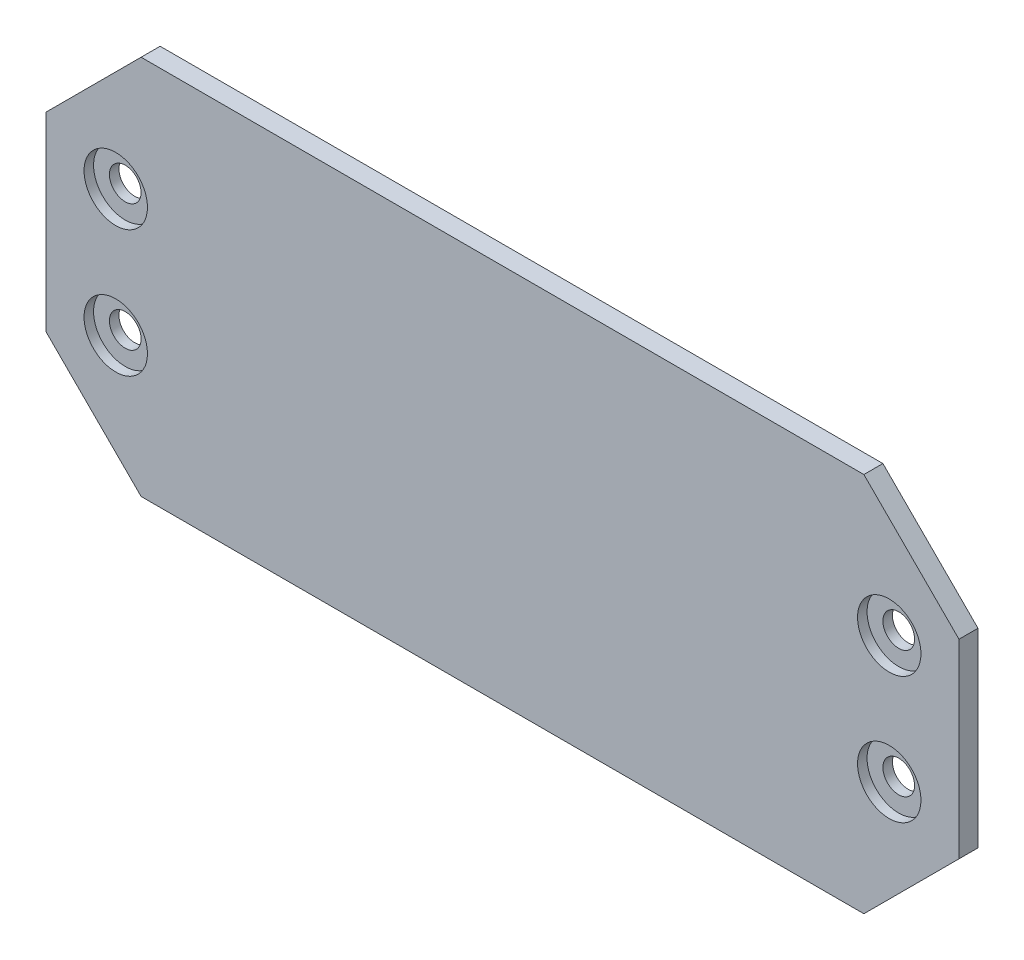
ISO-10303-21;
HEADER;
FILE_DESCRIPTION(('STEP AP214'),'2;1');
FILE_NAME('part.step','',(''),(''),'','','');
FILE_SCHEMA(('AUTOMOTIVE_DESIGN { 1 0 10303 214 1 1 1 1 }'));
ENDSEC;
DATA;
#1=APPLICATION_CONTEXT('core data for automotive mechanical design processes');
#2=APPLICATION_PROTOCOL_DEFINITION('international standard','automotive_design',2000,#1);
#3=PRODUCT_CONTEXT('',#1,'mechanical');
#4=PRODUCT('Part','Part','',(#3));
#5=PRODUCT_RELATED_PRODUCT_CATEGORY('part','',(#4));
#6=PRODUCT_DEFINITION_FORMATION('','',#4);
#7=PRODUCT_DEFINITION_CONTEXT('part definition',#1,'design');
#8=PRODUCT_DEFINITION('design','',#6,#7);
#9=PRODUCT_DEFINITION_SHAPE('','',#8);
#10=(LENGTH_UNIT() NAMED_UNIT(*) SI_UNIT(.MILLI.,.METRE.));
#11=(NAMED_UNIT(*) PLANE_ANGLE_UNIT() SI_UNIT($,.RADIAN.));
#12=(NAMED_UNIT(*) SI_UNIT($,.STERADIAN.) SOLID_ANGLE_UNIT());
#13=UNCERTAINTY_MEASURE_WITH_UNIT(LENGTH_MEASURE(1.E-05),#10,'distance_accuracy_value','');
#14=(GEOMETRIC_REPRESENTATION_CONTEXT(3) GLOBAL_UNCERTAINTY_ASSIGNED_CONTEXT((#13)) GLOBAL_UNIT_ASSIGNED_CONTEXT((#10,
#11,#12)) REPRESENTATION_CONTEXT('',''));
#15=CARTESIAN_POINT('',(0.,0.,0.));
#16=DIRECTION('',(0.,0.,1.));
#17=DIRECTION('',(1.,0.,0.));
#18=AXIS2_PLACEMENT_3D('',#15,#16,#17);
#19=CARTESIAN_POINT('',(-61.,10.,3.));
#20=DIRECTION('',(0.,0.,-1.));
#21=DIRECTION('',(-1.,0.,0.));
#22=AXIS2_PLACEMENT_3D('',#19,#20,#21);
#23=CYLINDRICAL_SURFACE('',#22,2.5);
#24=CARTESIAN_POINT('',(-61.,10.,0.));
#25=DIRECTION('',(0.,0.,1.));
#26=DIRECTION('',(1.,0.,0.));
#27=AXIS2_PLACEMENT_3D('',#24,#25,#26);
#28=CIRCLE('',#27,2.5);
#29=CARTESIAN_POINT('',(-58.5,10.,0.));
#30=VERTEX_POINT('',#29);
#31=EDGE_CURVE('E156',#30,#30,#28,.T.);
#32=ORIENTED_EDGE('',*,*,#31,.F.);
#33=EDGE_LOOP('',(#32));
#34=FACE_BOUND('',#33,.T.);
#35=CARTESIAN_POINT('',(-61.,10.,1.5));
#36=DIRECTION('',(0.,0.,1.));
#37=DIRECTION('',(1.,0.,0.));
#38=AXIS2_PLACEMENT_3D('',#35,#36,#37);
#39=CIRCLE('',#38,2.5);
#40=CARTESIAN_POINT('',(-58.5,10.,1.5));
#41=VERTEX_POINT('',#40);
#42=EDGE_CURVE('E42',#41,#41,#39,.T.);
#43=ORIENTED_EDGE('',*,*,#42,.T.);
#44=EDGE_LOOP('',(#43));
#45=FACE_BOUND('',#44,.T.);
#46=ADVANCED_FACE('F38',(#34,#45),#23,.F.);
#47=CARTESIAN_POINT('',(61.,10.,3.));
#48=DIRECTION('',(0.,0.,-1.));
#49=DIRECTION('',(-1.,0.,0.));
#50=AXIS2_PLACEMENT_3D('',#47,#48,#49);
#51=CYLINDRICAL_SURFACE('',#50,2.5);
#52=CARTESIAN_POINT('',(61.,10.,0.));
#53=DIRECTION('',(0.,0.,1.));
#54=DIRECTION('',(-1.,0.,0.));
#55=AXIS2_PLACEMENT_3D('',#52,#53,#54);
#56=CIRCLE('',#55,2.5);
#57=CARTESIAN_POINT('',(58.5,10.,0.));
#58=VERTEX_POINT('',#57);
#59=EDGE_CURVE('E218',#58,#58,#56,.T.);
#60=ORIENTED_EDGE('',*,*,#59,.F.);
#61=EDGE_LOOP('',(#60));
#62=FACE_BOUND('',#61,.T.);
#63=CARTESIAN_POINT('',(61.,10.,1.5));
#64=DIRECTION('',(0.,0.,1.));
#65=DIRECTION('',(1.,0.,0.));
#66=AXIS2_PLACEMENT_3D('',#63,#64,#65);
#67=CIRCLE('',#66,2.5);
#68=CARTESIAN_POINT('',(63.5,10.,1.5));
#69=VERTEX_POINT('',#68);
#70=EDGE_CURVE('E190',#69,#69,#67,.T.);
#71=ORIENTED_EDGE('',*,*,#70,.T.);
#72=EDGE_LOOP('',(#71));
#73=FACE_BOUND('',#72,.T.);
#74=ADVANCED_FACE('F262',(#62,#73),#51,.F.);
#75=CARTESIAN_POINT('',(61.,-10.,3.));
#76=DIRECTION('',(0.,0.,-1.));
#77=DIRECTION('',(-1.,0.,0.));
#78=AXIS2_PLACEMENT_3D('',#75,#76,#77);
#79=CYLINDRICAL_SURFACE('',#78,2.5);
#80=CARTESIAN_POINT('',(61.,-10.,0.));
#81=DIRECTION('',(0.,0.,1.));
#82=DIRECTION('',(1.,0.,0.));
#83=AXIS2_PLACEMENT_3D('',#80,#81,#82);
#84=CIRCLE('',#83,2.5);
#85=CARTESIAN_POINT('',(63.5,-10.,0.));
#86=VERTEX_POINT('',#85);
#87=EDGE_CURVE('E215',#86,#86,#84,.T.);
#88=ORIENTED_EDGE('',*,*,#87,.F.);
#89=EDGE_LOOP('',(#88));
#90=FACE_BOUND('',#89,.T.);
#91=CARTESIAN_POINT('',(61.,-10.,1.5));
#92=DIRECTION('',(0.,0.,1.));
#93=DIRECTION('',(1.,0.,0.));
#94=AXIS2_PLACEMENT_3D('',#91,#92,#93);
#95=CIRCLE('',#94,2.5);
#96=CARTESIAN_POINT('',(63.5,-10.,1.5));
#97=VERTEX_POINT('',#96);
#98=EDGE_CURVE('E188',#97,#97,#95,.T.);
#99=ORIENTED_EDGE('',*,*,#98,.T.);
#100=EDGE_LOOP('',(#99));
#101=FACE_BOUND('',#100,.T.);
#102=ADVANCED_FACE('F268',(#90,#101),#79,.F.);
#103=CARTESIAN_POINT('',(-61.,-10.,3.));
#104=DIRECTION('',(0.,0.,-1.));
#105=DIRECTION('',(-1.,0.,0.));
#106=AXIS2_PLACEMENT_3D('',#103,#104,#105);
#107=CYLINDRICAL_SURFACE('',#106,2.5);
#108=CARTESIAN_POINT('',(-61.,-10.,0.));
#109=DIRECTION('',(0.,0.,1.));
#110=DIRECTION('',(-1.,0.,0.));
#111=AXIS2_PLACEMENT_3D('',#108,#109,#110);
#112=CIRCLE('',#111,2.5);
#113=CARTESIAN_POINT('',(-63.5,-10.,0.));
#114=VERTEX_POINT('',#113);
#115=EDGE_CURVE('E186',#114,#114,#112,.T.);
#116=ORIENTED_EDGE('',*,*,#115,.F.);
#117=EDGE_LOOP('',(#116));
#118=FACE_BOUND('',#117,.T.);
#119=CARTESIAN_POINT('',(-61.,-10.,1.5));
#120=DIRECTION('',(0.,0.,1.));
#121=DIRECTION('',(1.,0.,0.));
#122=AXIS2_PLACEMENT_3D('',#119,#120,#121);
#123=CIRCLE('',#122,2.5);
#124=CARTESIAN_POINT('',(-58.5,-10.,1.5));
#125=VERTEX_POINT('',#124);
#126=EDGE_CURVE('E183',#125,#125,#123,.T.);
#127=ORIENTED_EDGE('',*,*,#126,.T.);
#128=EDGE_LOOP('',(#127));
#129=FACE_BOUND('',#128,.T.);
#130=ADVANCED_FACE('F275',(#118,#129),#107,.F.);
#131=CARTESIAN_POINT('',(0.,0.,3.));
#132=DIRECTION('',(0.,0.,-1.));
#133=DIRECTION('',(-1.,0.,0.));
#134=AXIS2_PLACEMENT_3D('',#131,#132,#133);
#135=PLANE('',#134);
#136=CARTESIAN_POINT('',(-61.,10.,3.));
#137=DIRECTION('',(0.,0.,1.));
#138=DIRECTION('',(1.,0.,0.));
#139=AXIS2_PLACEMENT_3D('',#136,#137,#138);
#140=CIRCLE('',#139,5.);
#141=CARTESIAN_POINT('',(-56.,10.,3.));
#142=VERTEX_POINT('',#141);
#143=EDGE_CURVE('E312',#142,#142,#140,.T.);
#144=ORIENTED_EDGE('',*,*,#143,.F.);
#145=EDGE_LOOP('',(#144));
#146=FACE_BOUND('',#145,.T.);
#147=CARTESIAN_POINT('',(61.,10.,3.));
#148=DIRECTION('',(0.,0.,1.));
#149=DIRECTION('',(1.,0.,0.));
#150=AXIS2_PLACEMENT_3D('',#147,#148,#149);
#151=CIRCLE('',#150,5.);
#152=CARTESIAN_POINT('',(66.,10.,3.));
#153=VERTEX_POINT('',#152);
#154=EDGE_CURVE('E301',#153,#153,#151,.T.);
#155=ORIENTED_EDGE('',*,*,#154,.F.);
#156=EDGE_LOOP('',(#155));
#157=FACE_BOUND('',#156,.T.);
#158=CARTESIAN_POINT('',(61.,-10.,3.));
#159=DIRECTION('',(0.,0.,1.));
#160=DIRECTION('',(1.,0.,0.));
#161=AXIS2_PLACEMENT_3D('',#158,#159,#160);
#162=CIRCLE('',#161,5.);
#163=CARTESIAN_POINT('',(66.,-10.,3.));
#164=VERTEX_POINT('',#163);
#165=EDGE_CURVE('E302',#164,#164,#162,.T.);
#166=ORIENTED_EDGE('',*,*,#165,.F.);
#167=EDGE_LOOP('',(#166));
#168=FACE_BOUND('',#167,.T.);
#169=CARTESIAN_POINT('',(-61.,-10.,3.));
#170=DIRECTION('',(0.,0.,1.));
#171=DIRECTION('',(1.,0.,0.));
#172=AXIS2_PLACEMENT_3D('',#169,#170,#171);
#173=CIRCLE('',#172,5.);
#174=CARTESIAN_POINT('',(-56.,-10.,3.));
#175=VERTEX_POINT('',#174);
#176=EDGE_CURVE('E200',#175,#175,#173,.T.);
#177=ORIENTED_EDGE('',*,*,#176,.F.);
#178=EDGE_LOOP('',(#177));
#179=FACE_BOUND('',#178,.T.);
#180=DIRECTION('',(-0.707106781186541,-0.707106781186554,0.));
#181=VECTOR('',#180,1.);
#182=CARTESIAN_POINT('',(-57.0000000000003,30.,3.));
#183=LINE('',#182,#181);
#184=CARTESIAN_POINT('',(-57.0000000000003,30.,3.));
#185=VERTEX_POINT('',#184);
#186=CARTESIAN_POINT('',(-72.,15.,3.));
#187=VERTEX_POINT('',#186);
#188=EDGE_CURVE('E170',#185,#187,#183,.T.);
#189=ORIENTED_EDGE('',*,*,#188,.T.);
#190=DIRECTION('',(0.,-1.,0.));
#191=VECTOR('',#190,1.);
#192=CARTESIAN_POINT('',(-72.,15.,3.));
#193=LINE('',#192,#191);
#194=CARTESIAN_POINT('',(-72.,-15.,3.));
#195=VERTEX_POINT('',#194);
#196=EDGE_CURVE('E107',#187,#195,#193,.T.);
#197=ORIENTED_EDGE('',*,*,#196,.T.);
#198=DIRECTION('',(0.707106781186541,-0.707106781186554,0.));
#199=VECTOR('',#198,1.);
#200=CARTESIAN_POINT('',(-57.0000000000003,-30.,3.));
#201=LINE('',#200,#199);
#202=CARTESIAN_POINT('',(-57.0000000000003,-30.,3.));
#203=VERTEX_POINT('',#202);
#204=EDGE_CURVE('E227',#195,#203,#201,.T.);
#205=ORIENTED_EDGE('',*,*,#204,.T.);
#206=DIRECTION('',(1.,0.,0.));
#207=VECTOR('',#206,1.);
#208=CARTESIAN_POINT('',(-57.0000000000003,-30.,3.));
#209=LINE('',#208,#207);
#210=CARTESIAN_POINT('',(57.0000000000003,-30.,3.));
#211=VERTEX_POINT('',#210);
#212=EDGE_CURVE('E229',#203,#211,#209,.T.);
#213=ORIENTED_EDGE('',*,*,#212,.T.);
#214=DIRECTION('',(0.707106781186541,0.707106781186554,0.));
#215=VECTOR('',#214,1.);
#216=CARTESIAN_POINT('',(57.0000000000003,-30.,3.));
#217=LINE('',#216,#215);
#218=CARTESIAN_POINT('',(72.,-15.,3.));
#219=VERTEX_POINT('',#218);
#220=EDGE_CURVE('E127',#211,#219,#217,.T.);
#221=ORIENTED_EDGE('',*,*,#220,.T.);
#222=DIRECTION('',(0.,1.,0.));
#223=VECTOR('',#222,1.);
#224=CARTESIAN_POINT('',(72.,15.,3.));
#225=LINE('',#224,#223);
#226=CARTESIAN_POINT('',(72.,15.,3.));
#227=VERTEX_POINT('',#226);
#228=EDGE_CURVE('E121',#219,#227,#225,.T.);
#229=ORIENTED_EDGE('',*,*,#228,.T.);
#230=DIRECTION('',(-0.707106781186541,0.707106781186554,0.));
#231=VECTOR('',#230,1.);
#232=CARTESIAN_POINT('',(57.0000000000003,30.,3.));
#233=LINE('',#232,#231);
#234=CARTESIAN_POINT('',(57.0000000000003,30.,3.));
#235=VERTEX_POINT('',#234);
#236=EDGE_CURVE('E125',#227,#235,#233,.T.);
#237=ORIENTED_EDGE('',*,*,#236,.T.);
#238=DIRECTION('',(-1.,0.,0.));
#239=VECTOR('',#238,1.);
#240=CARTESIAN_POINT('',(-57.0000000000003,30.,3.));
#241=LINE('',#240,#239);
#242=EDGE_CURVE('E61',#235,#185,#241,.T.);
#243=ORIENTED_EDGE('',*,*,#242,.T.);
#244=EDGE_LOOP('',(#189,#197,#205,#213,#221,#229,#237,#243));
#245=FACE_BOUND('',#244,.T.);
#246=ADVANCED_FACE('F123',(#146,#157,#168,#179,#245),#135,.F.);
#247=CARTESIAN_POINT('',(0.,0.,0.));
#248=DIRECTION('',(0.,0.,-1.));
#249=DIRECTION('',(-1.,0.,0.));
#250=AXIS2_PLACEMENT_3D('',#247,#248,#249);
#251=PLANE('',#250);
#252=ORIENTED_EDGE('',*,*,#87,.T.);
#253=EDGE_LOOP('',(#252));
#254=FACE_BOUND('',#253,.T.);
#255=ORIENTED_EDGE('',*,*,#31,.T.);
#256=EDGE_LOOP('',(#255));
#257=FACE_BOUND('',#256,.T.);
#258=DIRECTION('',(-0.707106781186541,-0.707106781186554,0.));
#259=VECTOR('',#258,1.);
#260=CARTESIAN_POINT('',(-57.0000000000003,30.,0.));
#261=LINE('',#260,#259);
#262=CARTESIAN_POINT('',(-57.0000000000003,30.,0.));
#263=VERTEX_POINT('',#262);
#264=CARTESIAN_POINT('',(-72.,15.,0.));
#265=VERTEX_POINT('',#264);
#266=EDGE_CURVE('E151',#263,#265,#261,.T.);
#267=ORIENTED_EDGE('',*,*,#266,.F.);
#268=DIRECTION('',(-1.,0.,0.));
#269=VECTOR('',#268,1.);
#270=CARTESIAN_POINT('',(-57.0000000000003,30.,0.));
#271=LINE('',#270,#269);
#272=CARTESIAN_POINT('',(57.0000000000003,30.,0.));
#273=VERTEX_POINT('',#272);
#274=EDGE_CURVE('E99',#273,#263,#271,.T.);
#275=ORIENTED_EDGE('',*,*,#274,.F.);
#276=DIRECTION('',(-0.707106781186541,0.707106781186554,0.));
#277=VECTOR('',#276,1.);
#278=CARTESIAN_POINT('',(57.0000000000003,30.,0.));
#279=LINE('',#278,#277);
#280=CARTESIAN_POINT('',(72.,15.,0.));
#281=VERTEX_POINT('',#280);
#282=EDGE_CURVE('E93',#281,#273,#279,.T.);
#283=ORIENTED_EDGE('',*,*,#282,.F.);
#284=DIRECTION('',(0.,1.,0.));
#285=VECTOR('',#284,1.);
#286=CARTESIAN_POINT('',(72.,15.,0.));
#287=LINE('',#286,#285);
#288=CARTESIAN_POINT('',(72.,-15.,0.));
#289=VERTEX_POINT('',#288);
#290=EDGE_CURVE('E136',#289,#281,#287,.T.);
#291=ORIENTED_EDGE('',*,*,#290,.F.);
#292=DIRECTION('',(0.707106781186541,0.707106781186554,0.));
#293=VECTOR('',#292,1.);
#294=CARTESIAN_POINT('',(57.0000000000003,-30.,0.));
#295=LINE('',#294,#293);
#296=CARTESIAN_POINT('',(57.0000000000003,-30.,0.));
#297=VERTEX_POINT('',#296);
#298=EDGE_CURVE('E162',#297,#289,#295,.T.);
#299=ORIENTED_EDGE('',*,*,#298,.F.);
#300=DIRECTION('',(1.,0.,0.));
#301=VECTOR('',#300,1.);
#302=CARTESIAN_POINT('',(-57.0000000000003,-30.,0.));
#303=LINE('',#302,#301);
#304=CARTESIAN_POINT('',(-57.0000000000003,-30.,0.));
#305=VERTEX_POINT('',#304);
#306=EDGE_CURVE('E160',#305,#297,#303,.T.);
#307=ORIENTED_EDGE('',*,*,#306,.F.);
#308=DIRECTION('',(0.707106781186541,-0.707106781186554,0.));
#309=VECTOR('',#308,1.);
#310=CARTESIAN_POINT('',(-57.0000000000003,-30.,0.));
#311=LINE('',#310,#309);
#312=CARTESIAN_POINT('',(-72.,-15.,0.));
#313=VERTEX_POINT('',#312);
#314=EDGE_CURVE('E158',#313,#305,#311,.T.);
#315=ORIENTED_EDGE('',*,*,#314,.F.);
#316=DIRECTION('',(0.,-1.,0.));
#317=VECTOR('',#316,1.);
#318=CARTESIAN_POINT('',(-72.,15.,0.));
#319=LINE('',#318,#317);
#320=EDGE_CURVE('E155',#265,#313,#319,.T.);
#321=ORIENTED_EDGE('',*,*,#320,.F.);
#322=EDGE_LOOP('',(#267,#275,#283,#291,#299,#307,#315,#321));
#323=FACE_BOUND('',#322,.T.);
#324=ORIENTED_EDGE('',*,*,#59,.T.);
#325=EDGE_LOOP('',(#324));
#326=FACE_BOUND('',#325,.T.);
#327=ORIENTED_EDGE('',*,*,#115,.T.);
#328=EDGE_LOOP('',(#327));
#329=FACE_BOUND('',#328,.T.);
#330=ADVANCED_FACE('F242',(#254,#257,#323,#326,#329),#251,.T.);
#331=CARTESIAN_POINT('',(-57.0000000000003,30.,3.));
#332=DIRECTION('',(0.707106781186554,-0.707106781186541,0.));
#333=DIRECTION('',(0.707106781186541,0.707106781186554,0.));
#334=AXIS2_PLACEMENT_3D('',#331,#332,#333);
#335=PLANE('',#334);
#336=ORIENTED_EDGE('',*,*,#266,.T.);
#337=DIRECTION('',(0.,0.,-1.));
#338=VECTOR('',#337,1.);
#339=CARTESIAN_POINT('',(-72.,15.,3.));
#340=LINE('',#339,#338);
#341=EDGE_CURVE('E11',#187,#265,#340,.T.);
#342=ORIENTED_EDGE('',*,*,#341,.F.);
#343=ORIENTED_EDGE('',*,*,#188,.F.);
#344=DIRECTION('',(0.,0.,-1.));
#345=VECTOR('',#344,1.);
#346=CARTESIAN_POINT('',(-57.0000000000003,30.,3.));
#347=LINE('',#346,#345);
#348=EDGE_CURVE('E147',#185,#263,#347,.T.);
#349=ORIENTED_EDGE('',*,*,#348,.T.);
#350=EDGE_LOOP('',(#336,#342,#343,#349));
#351=FACE_BOUND('',#350,.T.);
#352=ADVANCED_FACE('F40',(#351),#335,.F.);
#353=CARTESIAN_POINT('',(-72.,15.,3.));
#354=DIRECTION('',(1.,0.,0.));
#355=DIRECTION('',(0.,0.,-1.));
#356=AXIS2_PLACEMENT_3D('',#353,#354,#355);
#357=PLANE('',#356);
#358=ORIENTED_EDGE('',*,*,#320,.T.);
#359=DIRECTION('',(0.,0.,-1.));
#360=VECTOR('',#359,1.);
#361=CARTESIAN_POINT('',(-72.,-15.,3.));
#362=LINE('',#361,#360);
#363=EDGE_CURVE('E49',#195,#313,#362,.T.);
#364=ORIENTED_EDGE('',*,*,#363,.F.);
#365=ORIENTED_EDGE('',*,*,#196,.F.);
#366=ORIENTED_EDGE('',*,*,#341,.T.);
#367=EDGE_LOOP('',(#358,#364,#365,#366));
#368=FACE_BOUND('',#367,.T.);
#369=ADVANCED_FACE('F282',(#368),#357,.F.);
#370=CARTESIAN_POINT('',(-57.0000000000003,-30.,3.));
#371=DIRECTION('',(0.707106781186554,0.707106781186541,0.));
#372=DIRECTION('',(-0.707106781186541,0.707106781186554,0.));
#373=AXIS2_PLACEMENT_3D('',#370,#371,#372);
#374=PLANE('',#373);
#375=ORIENTED_EDGE('',*,*,#314,.T.);
#376=DIRECTION('',(0.,0.,-1.));
#377=VECTOR('',#376,1.);
#378=CARTESIAN_POINT('',(-57.0000000000003,-30.,3.));
#379=LINE('',#378,#377);
#380=EDGE_CURVE('E178',#203,#305,#379,.T.);
#381=ORIENTED_EDGE('',*,*,#380,.F.);
#382=ORIENTED_EDGE('',*,*,#204,.F.);
#383=ORIENTED_EDGE('',*,*,#363,.T.);
#384=EDGE_LOOP('',(#375,#381,#382,#383));
#385=FACE_BOUND('',#384,.T.);
#386=ADVANCED_FACE('F378',(#385),#374,.F.);
#387=CARTESIAN_POINT('',(-57.0000000000003,-30.,3.));
#388=DIRECTION('',(0.,1.,0.));
#389=DIRECTION('',(0.,0.,1.));
#390=AXIS2_PLACEMENT_3D('',#387,#388,#389);
#391=PLANE('',#390);
#392=ORIENTED_EDGE('',*,*,#306,.T.);
#393=DIRECTION('',(0.,0.,-1.));
#394=VECTOR('',#393,1.);
#395=CARTESIAN_POINT('',(57.0000000000003,-30.,3.));
#396=LINE('',#395,#394);
#397=EDGE_CURVE('E175',#211,#297,#396,.T.);
#398=ORIENTED_EDGE('',*,*,#397,.F.);
#399=ORIENTED_EDGE('',*,*,#212,.F.);
#400=ORIENTED_EDGE('',*,*,#380,.T.);
#401=EDGE_LOOP('',(#392,#398,#399,#400));
#402=FACE_BOUND('',#401,.T.);
#403=ADVANCED_FACE('F235',(#402),#391,.F.);
#404=CARTESIAN_POINT('',(57.0000000000003,-30.,3.));
#405=DIRECTION('',(-0.707106781186554,0.707106781186541,0.));
#406=DIRECTION('',(-0.707106781186541,-0.707106781186554,0.));
#407=AXIS2_PLACEMENT_3D('',#404,#405,#406);
#408=PLANE('',#407);
#409=ORIENTED_EDGE('',*,*,#298,.T.);
#410=DIRECTION('',(0.,0.,-1.));
#411=VECTOR('',#410,1.);
#412=CARTESIAN_POINT('',(72.,-15.,3.));
#413=LINE('',#412,#411);
#414=EDGE_CURVE('E138',#219,#289,#413,.T.);
#415=ORIENTED_EDGE('',*,*,#414,.F.);
#416=ORIENTED_EDGE('',*,*,#220,.F.);
#417=ORIENTED_EDGE('',*,*,#397,.T.);
#418=EDGE_LOOP('',(#409,#415,#416,#417));
#419=FACE_BOUND('',#418,.T.);
#420=ADVANCED_FACE('F239',(#419),#408,.F.);
#421=CARTESIAN_POINT('',(72.,15.,3.));
#422=DIRECTION('',(-1.,0.,0.));
#423=DIRECTION('',(0.,0.,1.));
#424=AXIS2_PLACEMENT_3D('',#421,#422,#423);
#425=PLANE('',#424);
#426=ORIENTED_EDGE('',*,*,#290,.T.);
#427=DIRECTION('',(0.,0.,-1.));
#428=VECTOR('',#427,1.);
#429=CARTESIAN_POINT('',(72.,15.,3.));
#430=LINE('',#429,#428);
#431=EDGE_CURVE('E133',#227,#281,#430,.T.);
#432=ORIENTED_EDGE('',*,*,#431,.F.);
#433=ORIENTED_EDGE('',*,*,#228,.F.);
#434=ORIENTED_EDGE('',*,*,#414,.T.);
#435=EDGE_LOOP('',(#426,#432,#433,#434));
#436=FACE_BOUND('',#435,.T.);
#437=ADVANCED_FACE('F134',(#436),#425,.F.);
#438=CARTESIAN_POINT('',(57.0000000000003,30.,3.));
#439=DIRECTION('',(-0.707106781186554,-0.707106781186541,0.));
#440=DIRECTION('',(0.707106781186541,-0.707106781186554,0.));
#441=AXIS2_PLACEMENT_3D('',#438,#439,#440);
#442=PLANE('',#441);
#443=ORIENTED_EDGE('',*,*,#282,.T.);
#444=DIRECTION('',(0.,0.,-1.));
#445=VECTOR('',#444,1.);
#446=CARTESIAN_POINT('',(57.0000000000003,30.,3.));
#447=LINE('',#446,#445);
#448=EDGE_CURVE('E139',#235,#273,#447,.T.);
#449=ORIENTED_EDGE('',*,*,#448,.F.);
#450=ORIENTED_EDGE('',*,*,#236,.F.);
#451=ORIENTED_EDGE('',*,*,#431,.T.);
#452=EDGE_LOOP('',(#443,#449,#450,#451));
#453=FACE_BOUND('',#452,.T.);
#454=ADVANCED_FACE('F141',(#453),#442,.F.);
#455=CARTESIAN_POINT('',(-57.0000000000003,30.,3.));
#456=DIRECTION('',(0.,-1.,0.));
#457=DIRECTION('',(0.,0.,-1.));
#458=AXIS2_PLACEMENT_3D('',#455,#456,#457);
#459=PLANE('',#458);
#460=ORIENTED_EDGE('',*,*,#274,.T.);
#461=ORIENTED_EDGE('',*,*,#348,.F.);
#462=ORIENTED_EDGE('',*,*,#242,.F.);
#463=ORIENTED_EDGE('',*,*,#448,.T.);
#464=EDGE_LOOP('',(#460,#461,#462,#463));
#465=FACE_BOUND('',#464,.T.);
#466=ADVANCED_FACE('F248',(#465),#459,.F.);
#467=CARTESIAN_POINT('',(-61.,-10.,1.5));
#468=DIRECTION('',(0.,0.,1.));
#469=DIRECTION('',(1.,0.,0.));
#470=AXIS2_PLACEMENT_3D('',#467,#468,#469);
#471=CYLINDRICAL_SURFACE('',#470,5.);
#472=CARTESIAN_POINT('',(-61.,-10.,1.5));
#473=DIRECTION('',(0.,0.,1.));
#474=DIRECTION('',(1.,0.,0.));
#475=AXIS2_PLACEMENT_3D('',#472,#473,#474);
#476=CIRCLE('',#475,5.);
#477=CARTESIAN_POINT('',(-56.,-10.,1.5));
#478=VERTEX_POINT('',#477);
#479=EDGE_CURVE('E187',#478,#478,#476,.T.);
#480=ORIENTED_EDGE('',*,*,#479,.F.);
#481=EDGE_LOOP('',(#480));
#482=FACE_BOUND('',#481,.T.);
#483=ORIENTED_EDGE('',*,*,#176,.T.);
#484=EDGE_LOOP('',(#483));
#485=FACE_BOUND('',#484,.T.);
#486=ADVANCED_FACE('F250',(#482,#485),#471,.F.);
#487=CARTESIAN_POINT('',(-61.,-10.,1.5));
#488=DIRECTION('',(0.,0.,1.));
#489=DIRECTION('',(1.,0.,0.));
#490=AXIS2_PLACEMENT_3D('',#487,#488,#489);
#491=PLANE('',#490);
#492=ORIENTED_EDGE('',*,*,#126,.F.);
#493=EDGE_LOOP('',(#492));
#494=FACE_BOUND('',#493,.T.);
#495=ORIENTED_EDGE('',*,*,#479,.T.);
#496=EDGE_LOOP('',(#495));
#497=FACE_BOUND('',#496,.T.);
#498=ADVANCED_FACE('F256',(#494,#497),#491,.T.);
#499=CARTESIAN_POINT('',(61.,-10.,1.5));
#500=DIRECTION('',(0.,0.,1.));
#501=DIRECTION('',(1.,0.,0.));
#502=AXIS2_PLACEMENT_3D('',#499,#500,#501);
#503=CYLINDRICAL_SURFACE('',#502,5.);
#504=CARTESIAN_POINT('',(61.,-10.,1.5));
#505=DIRECTION('',(0.,0.,1.));
#506=DIRECTION('',(1.,0.,0.));
#507=AXIS2_PLACEMENT_3D('',#504,#505,#506);
#508=CIRCLE('',#507,5.);
#509=CARTESIAN_POINT('',(66.,-10.,1.5));
#510=VERTEX_POINT('',#509);
#511=EDGE_CURVE('E298',#510,#510,#508,.T.);
#512=ORIENTED_EDGE('',*,*,#511,.F.);
#513=EDGE_LOOP('',(#512));
#514=FACE_BOUND('',#513,.T.);
#515=ORIENTED_EDGE('',*,*,#165,.T.);
#516=EDGE_LOOP('',(#515));
#517=FACE_BOUND('',#516,.T.);
#518=ADVANCED_FACE('F294',(#514,#517),#503,.F.);
#519=CARTESIAN_POINT('',(61.,-10.,1.5));
#520=DIRECTION('',(0.,0.,1.));
#521=DIRECTION('',(1.,0.,0.));
#522=AXIS2_PLACEMENT_3D('',#519,#520,#521);
#523=PLANE('',#522);
#524=ORIENTED_EDGE('',*,*,#98,.F.);
#525=EDGE_LOOP('',(#524));
#526=FACE_BOUND('',#525,.T.);
#527=ORIENTED_EDGE('',*,*,#511,.T.);
#528=EDGE_LOOP('',(#527));
#529=FACE_BOUND('',#528,.T.);
#530=ADVANCED_FACE('F290',(#526,#529),#523,.T.);
#531=CARTESIAN_POINT('',(61.,10.,1.5));
#532=DIRECTION('',(0.,0.,1.));
#533=DIRECTION('',(1.,0.,0.));
#534=AXIS2_PLACEMENT_3D('',#531,#532,#533);
#535=CYLINDRICAL_SURFACE('',#534,5.);
#536=CARTESIAN_POINT('',(61.,10.,1.5));
#537=DIRECTION('',(0.,0.,1.));
#538=DIRECTION('',(1.,0.,0.));
#539=AXIS2_PLACEMENT_3D('',#536,#537,#538);
#540=CIRCLE('',#539,5.);
#541=CARTESIAN_POINT('',(66.,10.,1.5));
#542=VERTEX_POINT('',#541);
#543=EDGE_CURVE('E306',#542,#542,#540,.T.);
#544=ORIENTED_EDGE('',*,*,#543,.F.);
#545=EDGE_LOOP('',(#544));
#546=FACE_BOUND('',#545,.T.);
#547=ORIENTED_EDGE('',*,*,#154,.T.);
#548=EDGE_LOOP('',(#547));
#549=FACE_BOUND('',#548,.T.);
#550=ADVANCED_FACE('F293',(#546,#549),#535,.F.);
#551=CARTESIAN_POINT('',(61.,10.,1.5));
#552=DIRECTION('',(0.,0.,1.));
#553=DIRECTION('',(1.,0.,0.));
#554=AXIS2_PLACEMENT_3D('',#551,#552,#553);
#555=PLANE('',#554);
#556=ORIENTED_EDGE('',*,*,#70,.F.);
#557=EDGE_LOOP('',(#556));
#558=FACE_BOUND('',#557,.T.);
#559=ORIENTED_EDGE('',*,*,#543,.T.);
#560=EDGE_LOOP('',(#559));
#561=FACE_BOUND('',#560,.T.);
#562=ADVANCED_FACE('F324',(#558,#561),#555,.T.);
#563=CARTESIAN_POINT('',(-61.,10.,1.5));
#564=DIRECTION('',(0.,0.,1.));
#565=DIRECTION('',(1.,0.,0.));
#566=AXIS2_PLACEMENT_3D('',#563,#564,#565);
#567=CYLINDRICAL_SURFACE('',#566,5.);
#568=CARTESIAN_POINT('',(-61.,10.,1.5));
#569=DIRECTION('',(0.,0.,1.));
#570=DIRECTION('',(1.,0.,0.));
#571=AXIS2_PLACEMENT_3D('',#568,#569,#570);
#572=CIRCLE('',#571,5.);
#573=CARTESIAN_POINT('',(-56.,10.,1.5));
#574=VERTEX_POINT('',#573);
#575=EDGE_CURVE('E191',#574,#574,#572,.T.);
#576=ORIENTED_EDGE('',*,*,#575,.F.);
#577=EDGE_LOOP('',(#576));
#578=FACE_BOUND('',#577,.T.);
#579=ORIENTED_EDGE('',*,*,#143,.T.);
#580=EDGE_LOOP('',(#579));
#581=FACE_BOUND('',#580,.T.);
#582=ADVANCED_FACE('F321',(#578,#581),#567,.F.);
#583=CARTESIAN_POINT('',(-61.,10.,1.5));
#584=DIRECTION('',(0.,0.,1.));
#585=DIRECTION('',(1.,0.,0.));
#586=AXIS2_PLACEMENT_3D('',#583,#584,#585);
#587=PLANE('',#586);
#588=ORIENTED_EDGE('',*,*,#42,.F.);
#589=EDGE_LOOP('',(#588));
#590=FACE_BOUND('',#589,.T.);
#591=ORIENTED_EDGE('',*,*,#575,.T.);
#592=EDGE_LOOP('',(#591));
#593=FACE_BOUND('',#592,.T.);
#594=ADVANCED_FACE('F319',(#590,#593),#587,.T.);
#595=CLOSED_SHELL('',(#46,#74,#102,#130,#246,#330,#352,#369,#386,#403,#420,#437,#454,#466,#486,
#498,#518,#530,#550,#562,#582,#594));
#596=MANIFOLD_SOLID_BREP('B2',#595);
#597=ADVANCED_BREP_SHAPE_REPRESENTATION('',(#18,#596),#14);
#598=SHAPE_DEFINITION_REPRESENTATION(#9,#597);
ENDSEC;
END-ISO-10303-21;
